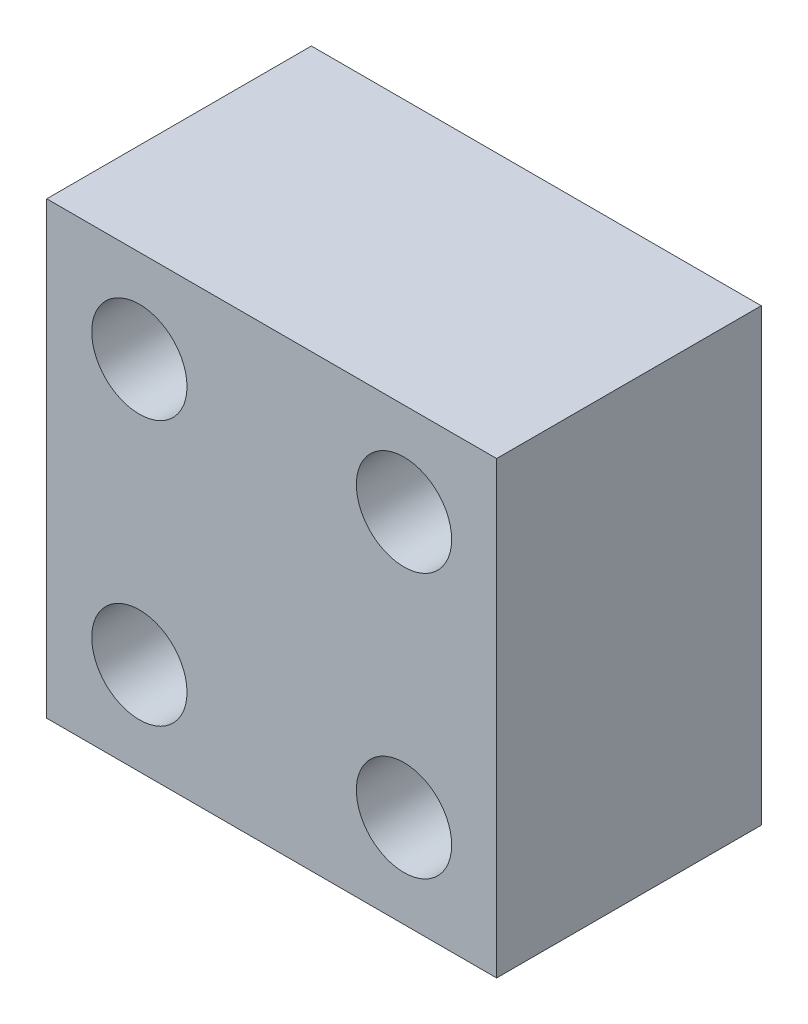
ISO-10303-21;
HEADER;
FILE_DESCRIPTION(('STEP AP214'),'2;1');
FILE_NAME('part.step','',(''),(''),'','','');
FILE_SCHEMA(('AUTOMOTIVE_DESIGN { 1 0 10303 214 1 1 1 1 }'));
ENDSEC;
DATA;
#1=APPLICATION_CONTEXT('core data for automotive mechanical design processes');
#2=APPLICATION_PROTOCOL_DEFINITION('international standard','automotive_design',2000,#1);
#3=PRODUCT_CONTEXT('',#1,'mechanical');
#4=PRODUCT('Part','Part','',(#3));
#5=PRODUCT_RELATED_PRODUCT_CATEGORY('part','',(#4));
#6=PRODUCT_DEFINITION_FORMATION('','',#4);
#7=PRODUCT_DEFINITION_CONTEXT('part definition',#1,'design');
#8=PRODUCT_DEFINITION('design','',#6,#7);
#9=PRODUCT_DEFINITION_SHAPE('','',#8);
#10=(LENGTH_UNIT() NAMED_UNIT(*) SI_UNIT(.MILLI.,.METRE.));
#11=(NAMED_UNIT(*) PLANE_ANGLE_UNIT() SI_UNIT($,.RADIAN.));
#12=(NAMED_UNIT(*) SI_UNIT($,.STERADIAN.) SOLID_ANGLE_UNIT());
#13=UNCERTAINTY_MEASURE_WITH_UNIT(LENGTH_MEASURE(1.E-05),#10,'distance_accuracy_value','');
#14=(GEOMETRIC_REPRESENTATION_CONTEXT(3) GLOBAL_UNCERTAINTY_ASSIGNED_CONTEXT((#13)) GLOBAL_UNIT_ASSIGNED_CONTEXT((#10,
#11,#12)) REPRESENTATION_CONTEXT('',''));
#15=CARTESIAN_POINT('',(0.,0.,0.));
#16=DIRECTION('',(0.,0.,1.));
#17=DIRECTION('',(1.,0.,0.));
#18=AXIS2_PLACEMENT_3D('',#15,#16,#17);
#19=CARTESIAN_POINT('',(152.0000000728,86.9989994688033,10.));
#20=DIRECTION('',(0.,1.,0.));
#21=DIRECTION('',(0.,0.,1.));
#22=AXIS2_PLACEMENT_3D('',#19,#20,#21);
#23=PLANE('',#22);
#24=DIRECTION('',(1.,0.,0.));
#25=VECTOR('',#24,1.);
#26=CARTESIAN_POINT('',(152.0000000728,86.9989994688033,0.));
#27=LINE('',#26,#25);
#28=CARTESIAN_POINT('',(152.0000000728,86.9989994688033,0.));
#29=VERTEX_POINT('',#28);
#30=CARTESIAN_POINT('',(169.0000000728,86.9989994688033,0.));
#31=VERTEX_POINT('',#30);
#32=EDGE_CURVE('E102',#29,#31,#27,.T.);
#33=ORIENTED_EDGE('',*,*,#32,.T.);
#34=DIRECTION('',(0.,0.,-1.));
#35=VECTOR('',#34,1.);
#36=CARTESIAN_POINT('',(169.0000000728,86.9989994688033,10.));
#37=LINE('',#36,#35);
#38=CARTESIAN_POINT('',(169.0000000728,86.9989994688033,10.));
#39=VERTEX_POINT('',#38);
#40=EDGE_CURVE('E11',#39,#31,#37,.T.);
#41=ORIENTED_EDGE('',*,*,#40,.F.);
#42=DIRECTION('',(1.,0.,0.));
#43=VECTOR('',#42,1.);
#44=CARTESIAN_POINT('',(152.0000000728,86.9989994688033,10.));
#45=LINE('',#44,#43);
#46=CARTESIAN_POINT('',(152.0000000728,86.9989994688033,10.));
#47=VERTEX_POINT('',#46);
#48=EDGE_CURVE('E90',#47,#39,#45,.T.);
#49=ORIENTED_EDGE('',*,*,#48,.F.);
#50=DIRECTION('',(0.,0.,-1.));
#51=VECTOR('',#50,1.);
#52=CARTESIAN_POINT('',(152.0000000728,86.9989994688033,10.));
#53=LINE('',#52,#51);
#54=EDGE_CURVE('E98',#47,#29,#53,.T.);
#55=ORIENTED_EDGE('',*,*,#54,.T.);
#56=EDGE_LOOP('',(#33,#41,#49,#55));
#57=FACE_BOUND('',#56,.T.);
#58=ADVANCED_FACE('F39',(#57),#23,.F.);
#59=CARTESIAN_POINT('',(169.0000000728,86.9989994688033,10.));
#60=DIRECTION('',(-1.,0.,0.));
#61=DIRECTION('',(0.,0.,1.));
#62=AXIS2_PLACEMENT_3D('',#59,#60,#61);
#63=PLANE('',#62);
#64=DIRECTION('',(0.,1.,0.));
#65=VECTOR('',#64,1.);
#66=CARTESIAN_POINT('',(169.0000000728,86.9989994688033,0.));
#67=LINE('',#66,#65);
#68=CARTESIAN_POINT('',(169.0000000728,103.998999468803,0.));
#69=VERTEX_POINT('',#68);
#70=EDGE_CURVE('E94',#31,#69,#67,.T.);
#71=ORIENTED_EDGE('',*,*,#70,.T.);
#72=DIRECTION('',(0.,0.,-1.));
#73=VECTOR('',#72,1.);
#74=CARTESIAN_POINT('',(169.0000000728,103.998999468803,10.));
#75=LINE('',#74,#73);
#76=CARTESIAN_POINT('',(169.0000000728,103.998999468803,10.));
#77=VERTEX_POINT('',#76);
#78=EDGE_CURVE('E47',#77,#69,#75,.T.);
#79=ORIENTED_EDGE('',*,*,#78,.F.);
#80=DIRECTION('',(0.,1.,0.));
#81=VECTOR('',#80,1.);
#82=CARTESIAN_POINT('',(169.0000000728,86.9989994688033,10.));
#83=LINE('',#82,#81);
#84=EDGE_CURVE('E85',#39,#77,#83,.T.);
#85=ORIENTED_EDGE('',*,*,#84,.F.);
#86=ORIENTED_EDGE('',*,*,#40,.T.);
#87=EDGE_LOOP('',(#71,#79,#85,#86));
#88=FACE_BOUND('',#87,.T.);
#89=ADVANCED_FACE('F93',(#88),#63,.F.);
#90=CARTESIAN_POINT('',(169.0000000728,103.998999468803,10.));
#91=DIRECTION('',(0.,-1.,0.));
#92=DIRECTION('',(0.,0.,-1.));
#93=AXIS2_PLACEMENT_3D('',#90,#91,#92);
#94=PLANE('',#93);
#95=DIRECTION('',(-1.,0.,0.));
#96=VECTOR('',#95,1.);
#97=CARTESIAN_POINT('',(169.0000000728,103.998999468803,0.));
#98=LINE('',#97,#96);
#99=CARTESIAN_POINT('',(152.0000000728,103.998999468803,0.));
#100=VERTEX_POINT('',#99);
#101=EDGE_CURVE('E72',#69,#100,#98,.T.);
#102=ORIENTED_EDGE('',*,*,#101,.T.);
#103=DIRECTION('',(0.,0.,-1.));
#104=VECTOR('',#103,1.);
#105=CARTESIAN_POINT('',(152.0000000728,103.998999468803,10.));
#106=LINE('',#105,#104);
#107=CARTESIAN_POINT('',(152.0000000728,103.998999468803,10.));
#108=VERTEX_POINT('',#107);
#109=EDGE_CURVE('E95',#108,#100,#106,.T.);
#110=ORIENTED_EDGE('',*,*,#109,.F.);
#111=DIRECTION('',(-1.,0.,0.));
#112=VECTOR('',#111,1.);
#113=CARTESIAN_POINT('',(169.0000000728,103.998999468803,10.));
#114=LINE('',#113,#112);
#115=EDGE_CURVE('E88',#77,#108,#114,.T.);
#116=ORIENTED_EDGE('',*,*,#115,.F.);
#117=ORIENTED_EDGE('',*,*,#78,.T.);
#118=EDGE_LOOP('',(#102,#110,#116,#117));
#119=FACE_BOUND('',#118,.T.);
#120=ADVANCED_FACE('F96',(#119),#94,.F.);
#121=CARTESIAN_POINT('',(152.0000000728,103.998999468803,10.));
#122=DIRECTION('',(1.,0.,0.));
#123=DIRECTION('',(0.,0.,-1.));
#124=AXIS2_PLACEMENT_3D('',#121,#122,#123);
#125=PLANE('',#124);
#126=DIRECTION('',(0.,-1.,0.));
#127=VECTOR('',#126,1.);
#128=CARTESIAN_POINT('',(152.0000000728,103.998999468803,0.));
#129=LINE('',#128,#127);
#130=EDGE_CURVE('E78',#100,#29,#129,.T.);
#131=ORIENTED_EDGE('',*,*,#130,.T.);
#132=ORIENTED_EDGE('',*,*,#54,.F.);
#133=DIRECTION('',(0.,-1.,0.));
#134=VECTOR('',#133,1.);
#135=CARTESIAN_POINT('',(152.0000000728,103.998999468803,10.));
#136=LINE('',#135,#134);
#137=EDGE_CURVE('E55',#108,#47,#136,.T.);
#138=ORIENTED_EDGE('',*,*,#137,.F.);
#139=ORIENTED_EDGE('',*,*,#109,.T.);
#140=EDGE_LOOP('',(#131,#132,#138,#139));
#141=FACE_BOUND('',#140,.T.);
#142=ADVANCED_FACE('F110',(#141),#125,.F.);
#143=CARTESIAN_POINT('',(0.,0.,10.));
#144=DIRECTION('',(0.,0.,1.));
#145=DIRECTION('',(1.,0.,0.));
#146=AXIS2_PLACEMENT_3D('',#143,#144,#145);
#147=PLANE('',#146);
#148=CARTESIAN_POINT('',(155.5000000728,100.498999468803,10.));
#149=DIRECTION('',(0.,0.,1.));
#150=DIRECTION('',(1.,0.,0.));
#151=AXIS2_PLACEMENT_3D('',#148,#149,#150);
#152=CIRCLE('',#151,1.8);
#153=CARTESIAN_POINT('',(157.3000000728,100.498999468803,10.));
#154=VERTEX_POINT('',#153);
#155=EDGE_CURVE('E136',#154,#154,#152,.T.);
#156=ORIENTED_EDGE('',*,*,#155,.F.);
#157=EDGE_LOOP('',(#156));
#158=FACE_BOUND('',#157,.T.);
#159=CARTESIAN_POINT('',(155.5000000728,90.4989994688033,10.));
#160=DIRECTION('',(0.,0.,1.));
#161=DIRECTION('',(1.,0.,0.));
#162=AXIS2_PLACEMENT_3D('',#159,#160,#161);
#163=CIRCLE('',#162,1.8);
#164=CARTESIAN_POINT('',(157.3000000728,90.4989994688033,10.));
#165=VERTEX_POINT('',#164);
#166=EDGE_CURVE('E130',#165,#165,#163,.T.);
#167=ORIENTED_EDGE('',*,*,#166,.F.);
#168=EDGE_LOOP('',(#167));
#169=FACE_BOUND('',#168,.T.);
#170=CARTESIAN_POINT('',(165.5000000728,90.4989994688033,10.));
#171=DIRECTION('',(0.,0.,1.));
#172=DIRECTION('',(1.,0.,0.));
#173=AXIS2_PLACEMENT_3D('',#170,#171,#172);
#174=CIRCLE('',#173,1.8);
#175=CARTESIAN_POINT('',(167.3000000728,90.4989994688033,10.));
#176=VERTEX_POINT('',#175);
#177=EDGE_CURVE('E124',#176,#176,#174,.T.);
#178=ORIENTED_EDGE('',*,*,#177,.F.);
#179=EDGE_LOOP('',(#178));
#180=FACE_BOUND('',#179,.T.);
#181=CARTESIAN_POINT('',(165.5000000728,100.498999468803,10.));
#182=DIRECTION('',(0.,0.,1.));
#183=DIRECTION('',(1.,0.,0.));
#184=AXIS2_PLACEMENT_3D('',#181,#182,#183);
#185=CIRCLE('',#184,1.8);
#186=CARTESIAN_POINT('',(167.3000000728,100.498999468803,10.));
#187=VERTEX_POINT('',#186);
#188=EDGE_CURVE('E118',#187,#187,#185,.T.);
#189=ORIENTED_EDGE('',*,*,#188,.F.);
#190=EDGE_LOOP('',(#189));
#191=FACE_BOUND('',#190,.T.);
#192=ORIENTED_EDGE('',*,*,#48,.T.);
#193=ORIENTED_EDGE('',*,*,#84,.T.);
#194=ORIENTED_EDGE('',*,*,#115,.T.);
#195=ORIENTED_EDGE('',*,*,#137,.T.);
#196=EDGE_LOOP('',(#192,#193,#194,#195));
#197=FACE_BOUND('',#196,.T.);
#198=ADVANCED_FACE('F86',(#158,#169,#180,#191,#197),#147,.T.);
#199=CARTESIAN_POINT('',(0.,0.,0.));
#200=DIRECTION('',(0.,0.,1.));
#201=DIRECTION('',(1.,0.,0.));
#202=AXIS2_PLACEMENT_3D('',#199,#200,#201);
#203=PLANE('',#202);
#204=CARTESIAN_POINT('',(155.5000000728,100.498999468803,0.));
#205=DIRECTION('',(0.,0.,1.));
#206=DIRECTION('',(1.,0.,0.));
#207=AXIS2_PLACEMENT_3D('',#204,#205,#206);
#208=CIRCLE('',#207,1.8);
#209=CARTESIAN_POINT('',(157.3000000728,100.498999468803,0.));
#210=VERTEX_POINT('',#209);
#211=EDGE_CURVE('E133',#210,#210,#208,.T.);
#212=ORIENTED_EDGE('',*,*,#211,.T.);
#213=EDGE_LOOP('',(#212));
#214=FACE_BOUND('',#213,.T.);
#215=CARTESIAN_POINT('',(155.5000000728,90.4989994688033,0.));
#216=DIRECTION('',(0.,0.,1.));
#217=DIRECTION('',(1.,0.,0.));
#218=AXIS2_PLACEMENT_3D('',#215,#216,#217);
#219=CIRCLE('',#218,1.8);
#220=CARTESIAN_POINT('',(157.3000000728,90.4989994688033,0.));
#221=VERTEX_POINT('',#220);
#222=EDGE_CURVE('E127',#221,#221,#219,.T.);
#223=ORIENTED_EDGE('',*,*,#222,.T.);
#224=EDGE_LOOP('',(#223));
#225=FACE_BOUND('',#224,.T.);
#226=CARTESIAN_POINT('',(165.5000000728,90.4989994688033,0.));
#227=DIRECTION('',(0.,0.,1.));
#228=DIRECTION('',(1.,0.,0.));
#229=AXIS2_PLACEMENT_3D('',#226,#227,#228);
#230=CIRCLE('',#229,1.8);
#231=CARTESIAN_POINT('',(167.3000000728,90.4989994688033,0.));
#232=VERTEX_POINT('',#231);
#233=EDGE_CURVE('E121',#232,#232,#230,.T.);
#234=ORIENTED_EDGE('',*,*,#233,.T.);
#235=EDGE_LOOP('',(#234));
#236=FACE_BOUND('',#235,.T.);
#237=CARTESIAN_POINT('',(165.5000000728,100.498999468803,0.));
#238=DIRECTION('',(0.,0.,1.));
#239=DIRECTION('',(1.,0.,0.));
#240=AXIS2_PLACEMENT_3D('',#237,#238,#239);
#241=CIRCLE('',#240,1.8);
#242=CARTESIAN_POINT('',(167.3000000728,100.498999468803,0.));
#243=VERTEX_POINT('',#242);
#244=EDGE_CURVE('E105',#243,#243,#241,.T.);
#245=ORIENTED_EDGE('',*,*,#244,.T.);
#246=EDGE_LOOP('',(#245));
#247=FACE_BOUND('',#246,.T.);
#248=ORIENTED_EDGE('',*,*,#32,.F.);
#249=ORIENTED_EDGE('',*,*,#130,.F.);
#250=ORIENTED_EDGE('',*,*,#101,.F.);
#251=ORIENTED_EDGE('',*,*,#70,.F.);
#252=EDGE_LOOP('',(#248,#249,#250,#251));
#253=FACE_BOUND('',#252,.T.);
#254=ADVANCED_FACE('F113',(#214,#225,#236,#247,#253),#203,.F.);
#255=CARTESIAN_POINT('',(165.5000000728,100.498999468803,10.));
#256=DIRECTION('',(0.,0.,1.));
#257=DIRECTION('',(1.,0.,0.));
#258=AXIS2_PLACEMENT_3D('',#255,#256,#257);
#259=CYLINDRICAL_SURFACE('',#258,1.8);
#260=ORIENTED_EDGE('',*,*,#244,.F.);
#261=EDGE_LOOP('',(#260));
#262=FACE_BOUND('',#261,.T.);
#263=ORIENTED_EDGE('',*,*,#188,.T.);
#264=EDGE_LOOP('',(#263));
#265=FACE_BOUND('',#264,.T.);
#266=ADVANCED_FACE('F151',(#262,#265),#259,.F.);
#267=CARTESIAN_POINT('',(165.5000000728,90.4989994688033,10.));
#268=DIRECTION('',(0.,0.,1.));
#269=DIRECTION('',(1.,0.,0.));
#270=AXIS2_PLACEMENT_3D('',#267,#268,#269);
#271=CYLINDRICAL_SURFACE('',#270,1.8);
#272=ORIENTED_EDGE('',*,*,#233,.F.);
#273=EDGE_LOOP('',(#272));
#274=FACE_BOUND('',#273,.T.);
#275=ORIENTED_EDGE('',*,*,#177,.T.);
#276=EDGE_LOOP('',(#275));
#277=FACE_BOUND('',#276,.T.);
#278=ADVANCED_FACE('F153',(#274,#277),#271,.F.);
#279=CARTESIAN_POINT('',(155.5000000728,90.4989994688033,10.));
#280=DIRECTION('',(0.,0.,1.));
#281=DIRECTION('',(1.,0.,0.));
#282=AXIS2_PLACEMENT_3D('',#279,#280,#281);
#283=CYLINDRICAL_SURFACE('',#282,1.8);
#284=ORIENTED_EDGE('',*,*,#222,.F.);
#285=EDGE_LOOP('',(#284));
#286=FACE_BOUND('',#285,.T.);
#287=ORIENTED_EDGE('',*,*,#166,.T.);
#288=EDGE_LOOP('',(#287));
#289=FACE_BOUND('',#288,.T.);
#290=ADVANCED_FACE('F160',(#286,#289),#283,.F.);
#291=CARTESIAN_POINT('',(155.5000000728,100.498999468803,10.));
#292=DIRECTION('',(0.,0.,1.));
#293=DIRECTION('',(1.,0.,0.));
#294=AXIS2_PLACEMENT_3D('',#291,#292,#293);
#295=CYLINDRICAL_SURFACE('',#294,1.8);
#296=ORIENTED_EDGE('',*,*,#211,.F.);
#297=EDGE_LOOP('',(#296));
#298=FACE_BOUND('',#297,.T.);
#299=ORIENTED_EDGE('',*,*,#155,.T.);
#300=EDGE_LOOP('',(#299));
#301=FACE_BOUND('',#300,.T.);
#302=ADVANCED_FACE('F140',(#298,#301),#295,.F.);
#303=CLOSED_SHELL('',(#58,#89,#120,#142,#198,#254,#266,#278,#290,#302));
#304=MANIFOLD_SOLID_BREP('B2',#303);
#305=ADVANCED_BREP_SHAPE_REPRESENTATION('',(#18,#304),#14);
#306=SHAPE_DEFINITION_REPRESENTATION(#9,#305);
ENDSEC;
END-ISO-10303-21;
